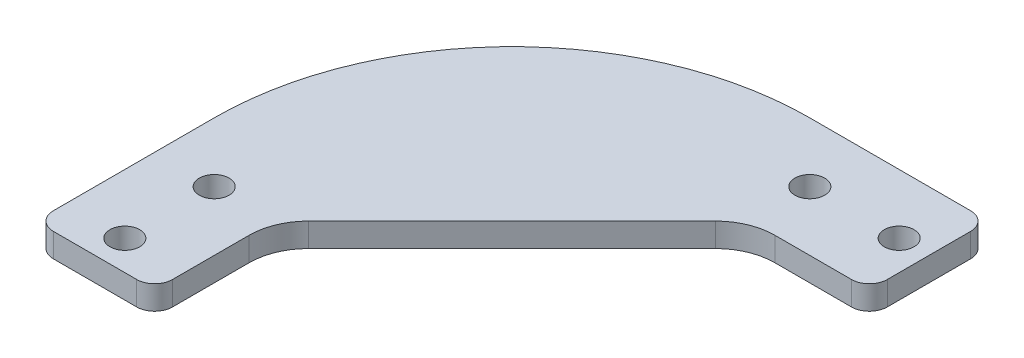
ISO-10303-21;
HEADER;
FILE_DESCRIPTION(('STEP AP214'),'2;1');
FILE_NAME('part.step','',(''),(''),'','','');
FILE_SCHEMA(('AUTOMOTIVE_DESIGN { 1 0 10303 214 1 1 1 1 }'));
ENDSEC;
DATA;
#1=APPLICATION_CONTEXT('core data for automotive mechanical design processes');
#2=APPLICATION_PROTOCOL_DEFINITION('international standard','automotive_design',2000,#1);
#3=PRODUCT_CONTEXT('',#1,'mechanical');
#4=PRODUCT('Part','Part','',(#3));
#5=PRODUCT_RELATED_PRODUCT_CATEGORY('part','',(#4));
#6=PRODUCT_DEFINITION_FORMATION('','',#4);
#7=PRODUCT_DEFINITION_CONTEXT('part definition',#1,'design');
#8=PRODUCT_DEFINITION('design','',#6,#7);
#9=PRODUCT_DEFINITION_SHAPE('','',#8);
#10=(LENGTH_UNIT() NAMED_UNIT(*) SI_UNIT(.MILLI.,.METRE.));
#11=(NAMED_UNIT(*) PLANE_ANGLE_UNIT() SI_UNIT($,.RADIAN.));
#12=(NAMED_UNIT(*) SI_UNIT($,.STERADIAN.) SOLID_ANGLE_UNIT());
#13=UNCERTAINTY_MEASURE_WITH_UNIT(LENGTH_MEASURE(1.E-05),#10,'distance_accuracy_value','');
#14=(GEOMETRIC_REPRESENTATION_CONTEXT(3) GLOBAL_UNCERTAINTY_ASSIGNED_CONTEXT((#13)) GLOBAL_UNIT_ASSIGNED_CONTEXT((#10,
#11,#12)) REPRESENTATION_CONTEXT('',''));
#15=CARTESIAN_POINT('',(0.,0.,0.));
#16=DIRECTION('',(0.,0.,1.));
#17=DIRECTION('',(1.,0.,0.));
#18=AXIS2_PLACEMENT_3D('',#15,#16,#17);
#19=CARTESIAN_POINT('',(0.,4.,0.));
#20=DIRECTION('',(0.,1.,0.));
#21=DIRECTION('',(0.,0.,1.));
#22=AXIS2_PLACEMENT_3D('',#19,#20,#21);
#23=PLANE('',#22);
#24=CARTESIAN_POINT('',(10.,4.,-40.));
#25=DIRECTION('',(0.,1.,0.));
#26=DIRECTION('',(0.,0.,1.));
#27=AXIS2_PLACEMENT_3D('',#24,#25,#26);
#28=CIRCLE('',#27,2.5);
#29=CARTESIAN_POINT('',(10.,4.,-37.5));
#30=VERTEX_POINT('',#29);
#31=EDGE_CURVE('E321',#30,#30,#28,.T.);
#32=ORIENTED_EDGE('',*,*,#31,.F.);
#33=EDGE_LOOP('',(#32));
#34=FACE_BOUND('',#33,.T.);
#35=CARTESIAN_POINT('',(-40.,4.,10.));
#36=DIRECTION('',(0.,1.,0.));
#37=DIRECTION('',(0.,0.,1.));
#38=AXIS2_PLACEMENT_3D('',#35,#36,#37);
#39=CIRCLE('',#38,2.49999999999999);
#40=CARTESIAN_POINT('',(-40.,4.,12.5));
#41=VERTEX_POINT('',#40);
#42=EDGE_CURVE('E174',#41,#41,#39,.T.);
#43=ORIENTED_EDGE('',*,*,#42,.F.);
#44=EDGE_LOOP('',(#43));
#45=FACE_BOUND('',#44,.T.);
#46=CARTESIAN_POINT('',(0.,4.,0.));
#47=DIRECTION('',(0.,1.,0.));
#48=DIRECTION('',(0.,0.,1.));
#49=AXIS2_PLACEMENT_3D('',#46,#47,#48);
#50=CIRCLE('',#49,50.);
#51=CARTESIAN_POINT('',(0.,4.,-50.));
#52=VERTEX_POINT('',#51);
#53=CARTESIAN_POINT('',(-50.,4.,0.));
#54=VERTEX_POINT('',#53);
#55=EDGE_CURVE('E197',#52,#54,#50,.T.);
#56=ORIENTED_EDGE('',*,*,#55,.T.);
#57=DIRECTION('',(0.,0.,1.));
#58=VECTOR('',#57,1.);
#59=CARTESIAN_POINT('',(-50.,4.,0.));
#60=LINE('',#59,#58);
#61=CARTESIAN_POINT('',(-50.,4.,27.));
#62=VERTEX_POINT('',#61);
#63=EDGE_CURVE('E115',#54,#62,#60,.T.);
#64=ORIENTED_EDGE('',*,*,#63,.T.);
#65=CARTESIAN_POINT('',(-47.,4.,27.));
#66=DIRECTION('',(0.,1.,0.));
#67=DIRECTION('',(0.,0.,1.));
#68=AXIS2_PLACEMENT_3D('',#65,#66,#67);
#69=CIRCLE('',#68,3.);
#70=CARTESIAN_POINT('',(-47.,4.,30.));
#71=VERTEX_POINT('',#70);
#72=EDGE_CURVE('E230',#62,#71,#69,.T.);
#73=ORIENTED_EDGE('',*,*,#72,.T.);
#74=DIRECTION('',(1.,0.,0.));
#75=VECTOR('',#74,1.);
#76=CARTESIAN_POINT('',(-47.,4.,30.));
#77=LINE('',#76,#75);
#78=CARTESIAN_POINT('',(-33.,4.,30.));
#79=VERTEX_POINT('',#78);
#80=EDGE_CURVE('E249',#71,#79,#77,.T.);
#81=ORIENTED_EDGE('',*,*,#80,.T.);
#82=CARTESIAN_POINT('',(-33.,4.,27.));
#83=DIRECTION('',(0.,1.,0.));
#84=DIRECTION('',(0.,0.,1.));
#85=AXIS2_PLACEMENT_3D('',#82,#83,#84);
#86=CIRCLE('',#85,3.);
#87=CARTESIAN_POINT('',(-30.,4.,27.));
#88=VERTEX_POINT('',#87);
#89=EDGE_CURVE('E246',#79,#88,#86,.T.);
#90=ORIENTED_EDGE('',*,*,#89,.T.);
#91=DIRECTION('',(0.,0.,-1.));
#92=VECTOR('',#91,1.);
#93=CARTESIAN_POINT('',(-30.,4.,27.));
#94=LINE('',#93,#92);
#95=CARTESIAN_POINT('',(-30.,4.,14.1421356237309));
#96=VERTEX_POINT('',#95);
#97=EDGE_CURVE('E248',#88,#96,#94,.T.);
#98=ORIENTED_EDGE('',*,*,#97,.T.);
#99=CARTESIAN_POINT('',(-20.,4.,14.1421356237309));
#100=DIRECTION('',(0.,-1.,0.));
#101=DIRECTION('',(0.,0.,1.));
#102=AXIS2_PLACEMENT_3D('',#99,#100,#101);
#103=CIRCLE('',#102,10.);
#104=CARTESIAN_POINT('',(-27.0710678118655,4.,7.07106781186547));
#105=VERTEX_POINT('',#104);
#106=EDGE_CURVE('E251',#96,#105,#103,.T.);
#107=ORIENTED_EDGE('',*,*,#106,.T.);
#108=DIRECTION('',(0.707106781186548,0.,-0.707106781186547));
#109=VECTOR('',#108,1.);
#110=CARTESIAN_POINT('',(7.07106781186547,4.,-27.0710678118655));
#111=LINE('',#110,#109);
#112=CARTESIAN_POINT('',(7.07106781186547,4.,-27.0710678118655));
#113=VERTEX_POINT('',#112);
#114=EDGE_CURVE('E257',#105,#113,#111,.T.);
#115=ORIENTED_EDGE('',*,*,#114,.T.);
#116=CARTESIAN_POINT('',(14.1421356237309,4.,-20.));
#117=DIRECTION('',(0.,-1.,0.));
#118=DIRECTION('',(0.,0.,-1.));
#119=AXIS2_PLACEMENT_3D('',#116,#117,#118);
#120=CIRCLE('',#119,9.99999999999999);
#121=CARTESIAN_POINT('',(14.1421356237309,4.,-30.));
#122=VERTEX_POINT('',#121);
#123=EDGE_CURVE('E259',#113,#122,#120,.T.);
#124=ORIENTED_EDGE('',*,*,#123,.T.);
#125=DIRECTION('',(1.,0.,0.));
#126=VECTOR('',#125,1.);
#127=CARTESIAN_POINT('',(27.,4.,-30.));
#128=LINE('',#127,#126);
#129=CARTESIAN_POINT('',(27.,4.,-30.));
#130=VERTEX_POINT('',#129);
#131=EDGE_CURVE('E261',#122,#130,#128,.T.);
#132=ORIENTED_EDGE('',*,*,#131,.T.);
#133=CARTESIAN_POINT('',(27.,4.,-33.));
#134=DIRECTION('',(0.,1.,0.));
#135=DIRECTION('',(0.,0.,-1.));
#136=AXIS2_PLACEMENT_3D('',#133,#134,#135);
#137=CIRCLE('',#136,3.);
#138=CARTESIAN_POINT('',(30.,4.,-33.));
#139=VERTEX_POINT('',#138);
#140=EDGE_CURVE('E152',#130,#139,#137,.T.);
#141=ORIENTED_EDGE('',*,*,#140,.T.);
#142=DIRECTION('',(0.,0.,-1.));
#143=VECTOR('',#142,1.);
#144=CARTESIAN_POINT('',(30.,4.,-47.));
#145=LINE('',#144,#143);
#146=CARTESIAN_POINT('',(30.,4.,-47.));
#147=VERTEX_POINT('',#146);
#148=EDGE_CURVE('E146',#139,#147,#145,.T.);
#149=ORIENTED_EDGE('',*,*,#148,.T.);
#150=CARTESIAN_POINT('',(27.,4.,-47.));
#151=DIRECTION('',(0.,1.,0.));
#152=DIRECTION('',(0.,0.,-1.));
#153=AXIS2_PLACEMENT_3D('',#150,#151,#152);
#154=CIRCLE('',#153,3.);
#155=CARTESIAN_POINT('',(27.,4.,-50.));
#156=VERTEX_POINT('',#155);
#157=EDGE_CURVE('E150',#147,#156,#154,.T.);
#158=ORIENTED_EDGE('',*,*,#157,.T.);
#159=DIRECTION('',(-1.,0.,0.));
#160=VECTOR('',#159,1.);
#161=CARTESIAN_POINT('',(0.,4.,-50.));
#162=LINE('',#161,#160);
#163=EDGE_CURVE('E54',#156,#52,#162,.T.);
#164=ORIENTED_EDGE('',*,*,#163,.T.);
#165=EDGE_LOOP('',(#56,#64,#73,#81,#90,#98,#107,#115,#124,#132,#141,#149,#158,#164));
#166=FACE_BOUND('',#165,.T.);
#167=CARTESIAN_POINT('',(-40.,4.,25.));
#168=DIRECTION('',(0.,1.,0.));
#169=DIRECTION('',(0.,0.,1.));
#170=AXIS2_PLACEMENT_3D('',#167,#168,#169);
#171=CIRCLE('',#170,2.49999999999999);
#172=CARTESIAN_POINT('',(-40.,4.,27.5));
#173=VERTEX_POINT('',#172);
#174=EDGE_CURVE('E327',#173,#173,#171,.T.);
#175=ORIENTED_EDGE('',*,*,#174,.F.);
#176=EDGE_LOOP('',(#175));
#177=FACE_BOUND('',#176,.T.);
#178=CARTESIAN_POINT('',(25.,4.,-40.));
#179=DIRECTION('',(0.,1.,0.));
#180=DIRECTION('',(0.,0.,1.));
#181=AXIS2_PLACEMENT_3D('',#178,#179,#180);
#182=CIRCLE('',#181,2.5);
#183=CARTESIAN_POINT('',(25.,4.,-37.5));
#184=VERTEX_POINT('',#183);
#185=EDGE_CURVE('E312',#184,#184,#182,.T.);
#186=ORIENTED_EDGE('',*,*,#185,.F.);
#187=EDGE_LOOP('',(#186));
#188=FACE_BOUND('',#187,.T.);
#189=ADVANCED_FACE('F37',(#34,#45,#166,#177,#188),#23,.T.);
#190=CARTESIAN_POINT('',(0.,0.,0.));
#191=DIRECTION('',(0.,1.,0.));
#192=DIRECTION('',(0.,0.,1.));
#193=AXIS2_PLACEMENT_3D('',#190,#191,#192);
#194=PLANE('',#193);
#195=CARTESIAN_POINT('',(0.,0.,0.));
#196=DIRECTION('',(0.,1.,0.));
#197=DIRECTION('',(0.,0.,1.));
#198=AXIS2_PLACEMENT_3D('',#195,#196,#197);
#199=CIRCLE('',#198,50.);
#200=CARTESIAN_POINT('',(0.,0.,-50.));
#201=VERTEX_POINT('',#200);
#202=CARTESIAN_POINT('',(-50.,0.,0.));
#203=VERTEX_POINT('',#202);
#204=EDGE_CURVE('E170',#201,#203,#199,.T.);
#205=ORIENTED_EDGE('',*,*,#204,.F.);
#206=DIRECTION('',(-1.,0.,0.));
#207=VECTOR('',#206,1.);
#208=CARTESIAN_POINT('',(0.,0.,-50.));
#209=LINE('',#208,#207);
#210=CARTESIAN_POINT('',(27.,0.,-50.));
#211=VERTEX_POINT('',#210);
#212=EDGE_CURVE('E107',#211,#201,#209,.T.);
#213=ORIENTED_EDGE('',*,*,#212,.F.);
#214=CARTESIAN_POINT('',(27.,0.,-47.));
#215=DIRECTION('',(0.,1.,0.));
#216=DIRECTION('',(0.,0.,-1.));
#217=AXIS2_PLACEMENT_3D('',#214,#215,#216);
#218=CIRCLE('',#217,3.);
#219=CARTESIAN_POINT('',(30.,0.,-47.));
#220=VERTEX_POINT('',#219);
#221=EDGE_CURVE('E101',#220,#211,#218,.T.);
#222=ORIENTED_EDGE('',*,*,#221,.F.);
#223=DIRECTION('',(0.,0.,-1.));
#224=VECTOR('',#223,1.);
#225=CARTESIAN_POINT('',(30.,0.,-47.));
#226=LINE('',#225,#224);
#227=CARTESIAN_POINT('',(30.,0.,-33.));
#228=VERTEX_POINT('',#227);
#229=EDGE_CURVE('E160',#228,#220,#226,.T.);
#230=ORIENTED_EDGE('',*,*,#229,.F.);
#231=CARTESIAN_POINT('',(27.,0.,-33.));
#232=DIRECTION('',(0.,1.,0.));
#233=DIRECTION('',(0.,0.,-1.));
#234=AXIS2_PLACEMENT_3D('',#231,#232,#233);
#235=CIRCLE('',#234,3.);
#236=CARTESIAN_POINT('',(27.,0.,-30.));
#237=VERTEX_POINT('',#236);
#238=EDGE_CURVE('E192',#237,#228,#235,.T.);
#239=ORIENTED_EDGE('',*,*,#238,.F.);
#240=DIRECTION('',(1.,0.,0.));
#241=VECTOR('',#240,1.);
#242=CARTESIAN_POINT('',(27.,0.,-30.));
#243=LINE('',#242,#241);
#244=CARTESIAN_POINT('',(14.1421356237309,0.,-30.));
#245=VERTEX_POINT('',#244);
#246=EDGE_CURVE('E190',#245,#237,#243,.T.);
#247=ORIENTED_EDGE('',*,*,#246,.F.);
#248=CARTESIAN_POINT('',(14.1421356237309,0.,-20.));
#249=DIRECTION('',(0.,-1.,0.));
#250=DIRECTION('',(0.,0.,-1.));
#251=AXIS2_PLACEMENT_3D('',#248,#249,#250);
#252=CIRCLE('',#251,9.99999999999999);
#253=CARTESIAN_POINT('',(7.07106781186547,0.,-27.0710678118655));
#254=VERTEX_POINT('',#253);
#255=EDGE_CURVE('E188',#254,#245,#252,.T.);
#256=ORIENTED_EDGE('',*,*,#255,.F.);
#257=DIRECTION('',(0.707106781186548,0.,-0.707106781186547));
#258=VECTOR('',#257,1.);
#259=CARTESIAN_POINT('',(7.07106781186547,0.,-27.0710678118655));
#260=LINE('',#259,#258);
#261=CARTESIAN_POINT('',(-27.0710678118655,0.,7.07106781186547));
#262=VERTEX_POINT('',#261);
#263=EDGE_CURVE('E186',#262,#254,#260,.T.);
#264=ORIENTED_EDGE('',*,*,#263,.F.);
#265=CARTESIAN_POINT('',(-20.,0.,14.1421356237309));
#266=DIRECTION('',(0.,-1.,0.));
#267=DIRECTION('',(0.,0.,1.));
#268=AXIS2_PLACEMENT_3D('',#265,#266,#267);
#269=CIRCLE('',#268,10.);
#270=CARTESIAN_POINT('',(-30.,0.,14.1421356237309));
#271=VERTEX_POINT('',#270);
#272=EDGE_CURVE('E184',#271,#262,#269,.T.);
#273=ORIENTED_EDGE('',*,*,#272,.F.);
#274=DIRECTION('',(0.,0.,-1.));
#275=VECTOR('',#274,1.);
#276=CARTESIAN_POINT('',(-30.,0.,27.));
#277=LINE('',#276,#275);
#278=CARTESIAN_POINT('',(-30.,0.,27.));
#279=VERTEX_POINT('',#278);
#280=EDGE_CURVE('E182',#279,#271,#277,.T.);
#281=ORIENTED_EDGE('',*,*,#280,.F.);
#282=CARTESIAN_POINT('',(-33.,0.,27.));
#283=DIRECTION('',(0.,1.,0.));
#284=DIRECTION('',(0.,0.,1.));
#285=AXIS2_PLACEMENT_3D('',#282,#283,#284);
#286=CIRCLE('',#285,3.);
#287=CARTESIAN_POINT('',(-33.,0.,30.));
#288=VERTEX_POINT('',#287);
#289=EDGE_CURVE('E180',#288,#279,#286,.T.);
#290=ORIENTED_EDGE('',*,*,#289,.F.);
#291=DIRECTION('',(1.,0.,0.));
#292=VECTOR('',#291,1.);
#293=CARTESIAN_POINT('',(-47.,0.,30.));
#294=LINE('',#293,#292);
#295=CARTESIAN_POINT('',(-47.,0.,30.));
#296=VERTEX_POINT('',#295);
#297=EDGE_CURVE('E178',#296,#288,#294,.T.);
#298=ORIENTED_EDGE('',*,*,#297,.F.);
#299=CARTESIAN_POINT('',(-47.,0.,27.));
#300=DIRECTION('',(0.,1.,0.));
#301=DIRECTION('',(0.,0.,1.));
#302=AXIS2_PLACEMENT_3D('',#299,#300,#301);
#303=CIRCLE('',#302,3.);
#304=CARTESIAN_POINT('',(-50.,0.,27.));
#305=VERTEX_POINT('',#304);
#306=EDGE_CURVE('E176',#305,#296,#303,.T.);
#307=ORIENTED_EDGE('',*,*,#306,.F.);
#308=DIRECTION('',(0.,0.,1.));
#309=VECTOR('',#308,1.);
#310=CARTESIAN_POINT('',(-50.,0.,0.));
#311=LINE('',#310,#309);
#312=EDGE_CURVE('E173',#203,#305,#311,.T.);
#313=ORIENTED_EDGE('',*,*,#312,.F.);
#314=EDGE_LOOP('',(#205,#213,#222,#230,#239,#247,#256,#264,#273,#281,#290,#298,#307,#313));
#315=FACE_BOUND('',#314,.T.);
#316=CARTESIAN_POINT('',(-40.,0.,10.));
#317=DIRECTION('',(0.,1.,0.));
#318=DIRECTION('',(0.,0.,1.));
#319=AXIS2_PLACEMENT_3D('',#316,#317,#318);
#320=CIRCLE('',#319,2.49999999999999);
#321=CARTESIAN_POINT('',(-40.,0.,12.5));
#322=VERTEX_POINT('',#321);
#323=EDGE_CURVE('E330',#322,#322,#320,.T.);
#324=ORIENTED_EDGE('',*,*,#323,.T.);
#325=EDGE_LOOP('',(#324));
#326=FACE_BOUND('',#325,.T.);
#327=CARTESIAN_POINT('',(-40.,0.,25.));
#328=DIRECTION('',(0.,1.,0.));
#329=DIRECTION('',(0.,0.,1.));
#330=AXIS2_PLACEMENT_3D('',#327,#328,#329);
#331=CIRCLE('',#330,2.49999999999999);
#332=CARTESIAN_POINT('',(-40.,0.,27.5));
#333=VERTEX_POINT('',#332);
#334=EDGE_CURVE('E324',#333,#333,#331,.T.);
#335=ORIENTED_EDGE('',*,*,#334,.T.);
#336=EDGE_LOOP('',(#335));
#337=FACE_BOUND('',#336,.T.);
#338=CARTESIAN_POINT('',(10.,0.,-40.));
#339=DIRECTION('',(0.,1.,0.));
#340=DIRECTION('',(0.,0.,1.));
#341=AXIS2_PLACEMENT_3D('',#338,#339,#340);
#342=CIRCLE('',#341,2.5);
#343=CARTESIAN_POINT('',(10.,0.,-37.5));
#344=VERTEX_POINT('',#343);
#345=EDGE_CURVE('E318',#344,#344,#342,.T.);
#346=ORIENTED_EDGE('',*,*,#345,.T.);
#347=EDGE_LOOP('',(#346));
#348=FACE_BOUND('',#347,.T.);
#349=CARTESIAN_POINT('',(25.,0.,-40.));
#350=DIRECTION('',(0.,1.,0.));
#351=DIRECTION('',(0.,0.,1.));
#352=AXIS2_PLACEMENT_3D('',#349,#350,#351);
#353=CIRCLE('',#352,2.5);
#354=CARTESIAN_POINT('',(25.,0.,-37.5));
#355=VERTEX_POINT('',#354);
#356=EDGE_CURVE('E315',#355,#355,#353,.T.);
#357=ORIENTED_EDGE('',*,*,#356,.T.);
#358=EDGE_LOOP('',(#357));
#359=FACE_BOUND('',#358,.T.);
#360=ADVANCED_FACE('F234',(#315,#326,#337,#348,#359),#194,.F.);
#361=CARTESIAN_POINT('',(0.,4.,0.));
#362=DIRECTION('',(0.,-1.,0.));
#363=DIRECTION('',(0.,0.,-1.));
#364=AXIS2_PLACEMENT_3D('',#361,#362,#363);
#365=CYLINDRICAL_SURFACE('',#364,50.);
#366=ORIENTED_EDGE('',*,*,#204,.T.);
#367=DIRECTION('',(0.,-1.,0.));
#368=VECTOR('',#367,1.);
#369=CARTESIAN_POINT('',(-50.,4.,0.));
#370=LINE('',#369,#368);
#371=EDGE_CURVE('E11',#54,#203,#370,.T.);
#372=ORIENTED_EDGE('',*,*,#371,.F.);
#373=ORIENTED_EDGE('',*,*,#55,.F.);
#374=DIRECTION('',(0.,-1.,0.));
#375=VECTOR('',#374,1.);
#376=CARTESIAN_POINT('',(0.,4.,-50.));
#377=LINE('',#376,#375);
#378=EDGE_CURVE('E166',#52,#201,#377,.T.);
#379=ORIENTED_EDGE('',*,*,#378,.T.);
#380=EDGE_LOOP('',(#366,#372,#373,#379));
#381=FACE_BOUND('',#380,.T.);
#382=ADVANCED_FACE('F39',(#381),#365,.T.);
#383=CARTESIAN_POINT('',(-50.,4.,0.));
#384=DIRECTION('',(1.,0.,0.));
#385=DIRECTION('',(0.,0.,-1.));
#386=AXIS2_PLACEMENT_3D('',#383,#384,#385);
#387=PLANE('',#386);
#388=ORIENTED_EDGE('',*,*,#312,.T.);
#389=DIRECTION('',(0.,-1.,0.));
#390=VECTOR('',#389,1.);
#391=CARTESIAN_POINT('',(-50.,4.,27.));
#392=LINE('',#391,#390);
#393=EDGE_CURVE('E46',#62,#305,#392,.T.);
#394=ORIENTED_EDGE('',*,*,#393,.F.);
#395=ORIENTED_EDGE('',*,*,#63,.F.);
#396=ORIENTED_EDGE('',*,*,#371,.T.);
#397=EDGE_LOOP('',(#388,#394,#395,#396));
#398=FACE_BOUND('',#397,.T.);
#399=ADVANCED_FACE('F460',(#398),#387,.F.);
#400=CARTESIAN_POINT('',(-47.,4.,27.));
#401=DIRECTION('',(0.,-1.,0.));
#402=DIRECTION('',(0.,0.,-1.));
#403=AXIS2_PLACEMENT_3D('',#400,#401,#402);
#404=CYLINDRICAL_SURFACE('',#403,3.);
#405=ORIENTED_EDGE('',*,*,#306,.T.);
#406=DIRECTION('',(0.,-1.,0.));
#407=VECTOR('',#406,1.);
#408=CARTESIAN_POINT('',(-47.,4.,30.));
#409=LINE('',#408,#407);
#410=EDGE_CURVE('E222',#71,#296,#409,.T.);
#411=ORIENTED_EDGE('',*,*,#410,.F.);
#412=ORIENTED_EDGE('',*,*,#72,.F.);
#413=ORIENTED_EDGE('',*,*,#393,.T.);
#414=EDGE_LOOP('',(#405,#411,#412,#413));
#415=FACE_BOUND('',#414,.T.);
#416=ADVANCED_FACE('F228',(#415),#404,.T.);
#417=CARTESIAN_POINT('',(-47.,4.,30.));
#418=DIRECTION('',(0.,0.,-1.));
#419=DIRECTION('',(-1.,0.,0.));
#420=AXIS2_PLACEMENT_3D('',#417,#418,#419);
#421=PLANE('',#420);
#422=ORIENTED_EDGE('',*,*,#297,.T.);
#423=DIRECTION('',(0.,-1.,0.));
#424=VECTOR('',#423,1.);
#425=CARTESIAN_POINT('',(-33.,4.,30.));
#426=LINE('',#425,#424);
#427=EDGE_CURVE('E219',#79,#288,#426,.T.);
#428=ORIENTED_EDGE('',*,*,#427,.F.);
#429=ORIENTED_EDGE('',*,*,#80,.F.);
#430=ORIENTED_EDGE('',*,*,#410,.T.);
#431=EDGE_LOOP('',(#422,#428,#429,#430));
#432=FACE_BOUND('',#431,.T.);
#433=ADVANCED_FACE('F240',(#432),#421,.F.);
#434=CARTESIAN_POINT('',(-33.,4.,27.));
#435=DIRECTION('',(0.,-1.,0.));
#436=DIRECTION('',(0.,0.,-1.));
#437=AXIS2_PLACEMENT_3D('',#434,#435,#436);
#438=CYLINDRICAL_SURFACE('',#437,3.);
#439=ORIENTED_EDGE('',*,*,#289,.T.);
#440=DIRECTION('',(0.,-1.,0.));
#441=VECTOR('',#440,1.);
#442=CARTESIAN_POINT('',(-30.,4.,27.));
#443=LINE('',#442,#441);
#444=EDGE_CURVE('E216',#88,#279,#443,.T.);
#445=ORIENTED_EDGE('',*,*,#444,.F.);
#446=ORIENTED_EDGE('',*,*,#89,.F.);
#447=ORIENTED_EDGE('',*,*,#427,.T.);
#448=EDGE_LOOP('',(#439,#445,#446,#447));
#449=FACE_BOUND('',#448,.T.);
#450=ADVANCED_FACE('F244',(#449),#438,.T.);
#451=CARTESIAN_POINT('',(-30.,4.,27.));
#452=DIRECTION('',(-1.,0.,0.));
#453=DIRECTION('',(0.,0.,1.));
#454=AXIS2_PLACEMENT_3D('',#451,#452,#453);
#455=PLANE('',#454);
#456=ORIENTED_EDGE('',*,*,#280,.T.);
#457=DIRECTION('',(0.,-1.,0.));
#458=VECTOR('',#457,1.);
#459=CARTESIAN_POINT('',(-30.,4.,14.1421356237309));
#460=LINE('',#459,#458);
#461=EDGE_CURVE('E213',#96,#271,#460,.T.);
#462=ORIENTED_EDGE('',*,*,#461,.F.);
#463=ORIENTED_EDGE('',*,*,#97,.F.);
#464=ORIENTED_EDGE('',*,*,#444,.T.);
#465=EDGE_LOOP('',(#456,#462,#463,#464));
#466=FACE_BOUND('',#465,.T.);
#467=ADVANCED_FACE('F425',(#466),#455,.F.);
#468=CARTESIAN_POINT('',(-20.,4.,14.1421356237309));
#469=DIRECTION('',(0.,-1.,0.));
#470=DIRECTION('',(0.,0.,-1.));
#471=AXIS2_PLACEMENT_3D('',#468,#469,#470);
#472=CYLINDRICAL_SURFACE('',#471,10.);
#473=ORIENTED_EDGE('',*,*,#272,.T.);
#474=DIRECTION('',(0.,-1.,0.));
#475=VECTOR('',#474,1.);
#476=CARTESIAN_POINT('',(-27.0710678118655,4.,7.07106781186547));
#477=LINE('',#476,#475);
#478=EDGE_CURVE('E210',#105,#262,#477,.T.);
#479=ORIENTED_EDGE('',*,*,#478,.F.);
#480=ORIENTED_EDGE('',*,*,#106,.F.);
#481=ORIENTED_EDGE('',*,*,#461,.T.);
#482=EDGE_LOOP('',(#473,#479,#480,#481));
#483=FACE_BOUND('',#482,.T.);
#484=ADVANCED_FACE('F415',(#483),#472,.F.);
#485=CARTESIAN_POINT('',(7.07106781186547,4.,-27.0710678118655));
#486=DIRECTION('',(-0.707106781186547,0.,-0.707106781186548));
#487=DIRECTION('',(-0.707106781186548,0.,0.707106781186547));
#488=AXIS2_PLACEMENT_3D('',#485,#486,#487);
#489=PLANE('',#488);
#490=ORIENTED_EDGE('',*,*,#263,.T.);
#491=DIRECTION('',(0.,-1.,0.));
#492=VECTOR('',#491,1.);
#493=CARTESIAN_POINT('',(7.07106781186547,4.,-27.0710678118655));
#494=LINE('',#493,#492);
#495=EDGE_CURVE('E207',#113,#254,#494,.T.);
#496=ORIENTED_EDGE('',*,*,#495,.F.);
#497=ORIENTED_EDGE('',*,*,#114,.F.);
#498=ORIENTED_EDGE('',*,*,#478,.T.);
#499=EDGE_LOOP('',(#490,#496,#497,#498));
#500=FACE_BOUND('',#499,.T.);
#501=ADVANCED_FACE('F405',(#500),#489,.F.);
#502=CARTESIAN_POINT('',(14.1421356237309,4.,-20.));
#503=DIRECTION('',(0.,-1.,0.));
#504=DIRECTION('',(0.,0.,-1.));
#505=AXIS2_PLACEMENT_3D('',#502,#503,#504);
#506=CYLINDRICAL_SURFACE('',#505,9.99999999999999);
#507=ORIENTED_EDGE('',*,*,#255,.T.);
#508=DIRECTION('',(0.,-1.,0.));
#509=VECTOR('',#508,1.);
#510=CARTESIAN_POINT('',(14.1421356237309,4.,-30.));
#511=LINE('',#510,#509);
#512=EDGE_CURVE('E204',#122,#245,#511,.T.);
#513=ORIENTED_EDGE('',*,*,#512,.F.);
#514=ORIENTED_EDGE('',*,*,#123,.F.);
#515=ORIENTED_EDGE('',*,*,#495,.T.);
#516=EDGE_LOOP('',(#507,#513,#514,#515));
#517=FACE_BOUND('',#516,.T.);
#518=ADVANCED_FACE('F396',(#517),#506,.F.);
#519=CARTESIAN_POINT('',(27.,4.,-30.));
#520=DIRECTION('',(0.,0.,-1.));
#521=DIRECTION('',(-1.,0.,0.));
#522=AXIS2_PLACEMENT_3D('',#519,#520,#521);
#523=PLANE('',#522);
#524=ORIENTED_EDGE('',*,*,#246,.T.);
#525=DIRECTION('',(0.,-1.,0.));
#526=VECTOR('',#525,1.);
#527=CARTESIAN_POINT('',(27.,4.,-30.));
#528=LINE('',#527,#526);
#529=EDGE_CURVE('E201',#130,#237,#528,.T.);
#530=ORIENTED_EDGE('',*,*,#529,.F.);
#531=ORIENTED_EDGE('',*,*,#131,.F.);
#532=ORIENTED_EDGE('',*,*,#512,.T.);
#533=EDGE_LOOP('',(#524,#530,#531,#532));
#534=FACE_BOUND('',#533,.T.);
#535=ADVANCED_FACE('F267',(#534),#523,.F.);
#536=CARTESIAN_POINT('',(27.,4.,-33.));
#537=DIRECTION('',(0.,-1.,0.));
#538=DIRECTION('',(0.,0.,-1.));
#539=AXIS2_PLACEMENT_3D('',#536,#537,#538);
#540=CYLINDRICAL_SURFACE('',#539,3.);
#541=ORIENTED_EDGE('',*,*,#238,.T.);
#542=DIRECTION('',(0.,-1.,0.));
#543=VECTOR('',#542,1.);
#544=CARTESIAN_POINT('',(30.,4.,-33.));
#545=LINE('',#544,#543);
#546=EDGE_CURVE('E161',#139,#228,#545,.T.);
#547=ORIENTED_EDGE('',*,*,#546,.F.);
#548=ORIENTED_EDGE('',*,*,#140,.F.);
#549=ORIENTED_EDGE('',*,*,#529,.T.);
#550=EDGE_LOOP('',(#541,#547,#548,#549));
#551=FACE_BOUND('',#550,.T.);
#552=ADVANCED_FACE('F271',(#551),#540,.T.);
#553=CARTESIAN_POINT('',(30.,4.,-47.));
#554=DIRECTION('',(-1.,0.,0.));
#555=DIRECTION('',(0.,0.,1.));
#556=AXIS2_PLACEMENT_3D('',#553,#554,#555);
#557=PLANE('',#556);
#558=ORIENTED_EDGE('',*,*,#229,.T.);
#559=DIRECTION('',(0.,-1.,0.));
#560=VECTOR('',#559,1.);
#561=CARTESIAN_POINT('',(30.,4.,-47.));
#562=LINE('',#561,#560);
#563=EDGE_CURVE('E157',#147,#220,#562,.T.);
#564=ORIENTED_EDGE('',*,*,#563,.F.);
#565=ORIENTED_EDGE('',*,*,#148,.F.);
#566=ORIENTED_EDGE('',*,*,#546,.T.);
#567=EDGE_LOOP('',(#558,#564,#565,#566));
#568=FACE_BOUND('',#567,.T.);
#569=ADVANCED_FACE('F158',(#568),#557,.F.);
#570=CARTESIAN_POINT('',(27.,4.,-47.));
#571=DIRECTION('',(0.,-1.,0.));
#572=DIRECTION('',(0.,0.,-1.));
#573=AXIS2_PLACEMENT_3D('',#570,#571,#572);
#574=CYLINDRICAL_SURFACE('',#573,3.);
#575=ORIENTED_EDGE('',*,*,#221,.T.);
#576=DIRECTION('',(0.,-1.,0.));
#577=VECTOR('',#576,1.);
#578=CARTESIAN_POINT('',(27.,4.,-50.));
#579=LINE('',#578,#577);
#580=EDGE_CURVE('E162',#156,#211,#579,.T.);
#581=ORIENTED_EDGE('',*,*,#580,.F.);
#582=ORIENTED_EDGE('',*,*,#157,.F.);
#583=ORIENTED_EDGE('',*,*,#563,.T.);
#584=EDGE_LOOP('',(#575,#581,#582,#583));
#585=FACE_BOUND('',#584,.T.);
#586=ADVANCED_FACE('F164',(#585),#574,.T.);
#587=CARTESIAN_POINT('',(0.,4.,-50.));
#588=DIRECTION('',(0.,0.,1.));
#589=DIRECTION('',(1.,0.,0.));
#590=AXIS2_PLACEMENT_3D('',#587,#588,#589);
#591=PLANE('',#590);
#592=ORIENTED_EDGE('',*,*,#212,.T.);
#593=ORIENTED_EDGE('',*,*,#378,.F.);
#594=ORIENTED_EDGE('',*,*,#163,.F.);
#595=ORIENTED_EDGE('',*,*,#580,.T.);
#596=EDGE_LOOP('',(#592,#593,#594,#595));
#597=FACE_BOUND('',#596,.T.);
#598=ADVANCED_FACE('F275',(#597),#591,.F.);
#599=CARTESIAN_POINT('',(-40.,4.,10.));
#600=DIRECTION('',(0.,-1.,0.));
#601=DIRECTION('',(0.,0.,-1.));
#602=AXIS2_PLACEMENT_3D('',#599,#600,#601);
#603=CYLINDRICAL_SURFACE('',#602,2.49999999999999);
#604=ORIENTED_EDGE('',*,*,#42,.T.);
#605=EDGE_LOOP('',(#604));
#606=FACE_BOUND('',#605,.T.);
#607=ORIENTED_EDGE('',*,*,#323,.F.);
#608=EDGE_LOOP('',(#607));
#609=FACE_BOUND('',#608,.T.);
#610=ADVANCED_FACE('F277',(#606,#609),#603,.F.);
#611=CARTESIAN_POINT('',(-40.,4.,25.));
#612=DIRECTION('',(0.,-1.,0.));
#613=DIRECTION('',(0.,0.,-1.));
#614=AXIS2_PLACEMENT_3D('',#611,#612,#613);
#615=CYLINDRICAL_SURFACE('',#614,2.49999999999999);
#616=ORIENTED_EDGE('',*,*,#174,.T.);
#617=EDGE_LOOP('',(#616));
#618=FACE_BOUND('',#617,.T.);
#619=ORIENTED_EDGE('',*,*,#334,.F.);
#620=EDGE_LOOP('',(#619));
#621=FACE_BOUND('',#620,.T.);
#622=ADVANCED_FACE('F283',(#618,#621),#615,.F.);
#623=CARTESIAN_POINT('',(10.,4.,-40.));
#624=DIRECTION('',(0.,-1.,0.));
#625=DIRECTION('',(0.,0.,-1.));
#626=AXIS2_PLACEMENT_3D('',#623,#624,#625);
#627=CYLINDRICAL_SURFACE('',#626,2.5);
#628=ORIENTED_EDGE('',*,*,#31,.T.);
#629=EDGE_LOOP('',(#628));
#630=FACE_BOUND('',#629,.T.);
#631=ORIENTED_EDGE('',*,*,#345,.F.);
#632=EDGE_LOOP('',(#631));
#633=FACE_BOUND('',#632,.T.);
#634=ADVANCED_FACE('F299',(#630,#633),#627,.F.);
#635=CARTESIAN_POINT('',(25.,4.,-40.));
#636=DIRECTION('',(0.,-1.,0.));
#637=DIRECTION('',(0.,0.,-1.));
#638=AXIS2_PLACEMENT_3D('',#635,#636,#637);
#639=CYLINDRICAL_SURFACE('',#638,2.5);
#640=ORIENTED_EDGE('',*,*,#185,.T.);
#641=EDGE_LOOP('',(#640));
#642=FACE_BOUND('',#641,.T.);
#643=ORIENTED_EDGE('',*,*,#356,.F.);
#644=EDGE_LOOP('',(#643));
#645=FACE_BOUND('',#644,.T.);
#646=ADVANCED_FACE('F303',(#642,#645),#639,.F.);
#647=CLOSED_SHELL('',(#189,#360,#382,#399,#416,#433,#450,#467,#484,#501,#518,#535,#552,#569,
#586,#598,#610,#622,#634,#646));
#648=MANIFOLD_SOLID_BREP('B2',#647);
#649=ADVANCED_BREP_SHAPE_REPRESENTATION('',(#18,#648),#14);
#650=SHAPE_DEFINITION_REPRESENTATION(#9,#649);
ENDSEC;
END-ISO-10303-21;
